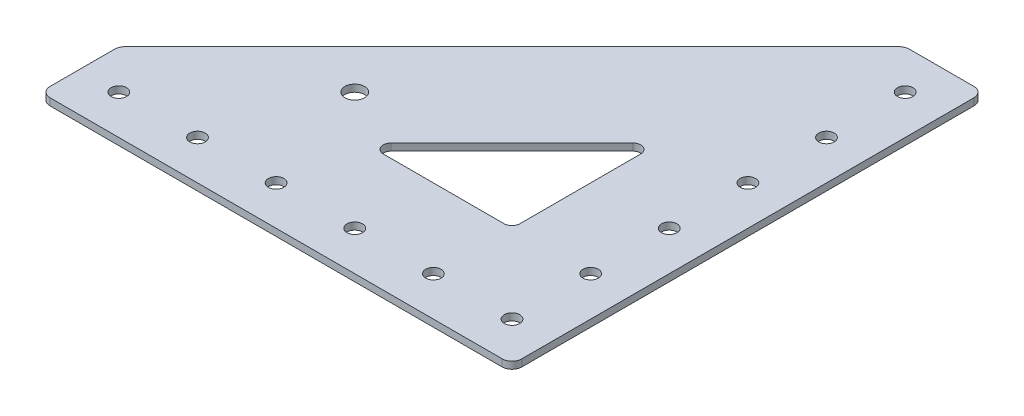
ISO-10303-21;
HEADER;
FILE_DESCRIPTION(('STEP AP214'),'2;1');
FILE_NAME('part.step','',(''),(''),'','','');
FILE_SCHEMA(('AUTOMOTIVE_DESIGN { 1 0 10303 214 1 1 1 1 }'));
ENDSEC;
DATA;
#1=APPLICATION_CONTEXT('core data for automotive mechanical design processes');
#2=APPLICATION_PROTOCOL_DEFINITION('international standard','automotive_design',2000,#1);
#3=PRODUCT_CONTEXT('',#1,'mechanical');
#4=PRODUCT('Part','Part','',(#3));
#5=PRODUCT_RELATED_PRODUCT_CATEGORY('part','',(#4));
#6=PRODUCT_DEFINITION_FORMATION('','',#4);
#7=PRODUCT_DEFINITION_CONTEXT('part definition',#1,'design');
#8=PRODUCT_DEFINITION('design','',#6,#7);
#9=PRODUCT_DEFINITION_SHAPE('','',#8);
#10=(LENGTH_UNIT() NAMED_UNIT(*) SI_UNIT(.MILLI.,.METRE.));
#11=(NAMED_UNIT(*) PLANE_ANGLE_UNIT() SI_UNIT($,.RADIAN.));
#12=(NAMED_UNIT(*) SI_UNIT($,.STERADIAN.) SOLID_ANGLE_UNIT());
#13=UNCERTAINTY_MEASURE_WITH_UNIT(LENGTH_MEASURE(1.E-05),#10,'distance_accuracy_value','');
#14=(GEOMETRIC_REPRESENTATION_CONTEXT(3) GLOBAL_UNCERTAINTY_ASSIGNED_CONTEXT((#13)) GLOBAL_UNIT_ASSIGNED_CONTEXT((#10,
#11,#12)) REPRESENTATION_CONTEXT('',''));
#15=CARTESIAN_POINT('',(0.,0.,0.));
#16=DIRECTION('',(0.,0.,1.));
#17=DIRECTION('',(1.,0.,0.));
#18=AXIS2_PLACEMENT_3D('',#15,#16,#17);
#19=CARTESIAN_POINT('',(0.,1.143,0.));
#20=DIRECTION('',(0.,1.,0.));
#21=DIRECTION('',(0.,0.,1.));
#22=AXIS2_PLACEMENT_3D('',#19,#20,#21);
#23=PLANE('',#22);
#24=DIRECTION('',(0.,0.,-1.));
#25=VECTOR('',#24,1.);
#26=CARTESIAN_POINT('',(-38.1,1.143,-38.1));
#27=LINE('',#26,#25);
#28=CARTESIAN_POINT('',(-38.1,1.143,-40.64));
#29=VERTEX_POINT('',#28);
#30=CARTESIAN_POINT('',(-38.1,1.143,-79.6863608251574));
#31=VERTEX_POINT('',#30);
#32=EDGE_CURVE('E265',#29,#31,#27,.T.);
#33=ORIENTED_EDGE('',*,*,#32,.F.);
#34=CARTESIAN_POINT('',(-40.64,1.143,-40.64));
#35=DIRECTION('',(0.,1.,0.));
#36=DIRECTION('',(0.,0.,1.));
#37=AXIS2_PLACEMENT_3D('',#34,#35,#36);
#38=CIRCLE('',#37,2.54);
#39=CARTESIAN_POINT('',(-40.64,1.143,-38.1));
#40=VERTEX_POINT('',#39);
#41=EDGE_CURVE('E253',#29,#40,#38,.F.);
#42=ORIENTED_EDGE('',*,*,#41,.T.);
#43=DIRECTION('',(1.,0.,0.));
#44=VECTOR('',#43,1.);
#45=CARTESIAN_POINT('',(-85.8184632735851,1.143,-38.1));
#46=LINE('',#45,#44);
#47=CARTESIAN_POINT('',(-79.6863608251574,1.143,-38.1));
#48=VERTEX_POINT('',#47);
#49=EDGE_CURVE('E286',#48,#40,#46,.T.);
#50=ORIENTED_EDGE('',*,*,#49,.F.);
#51=CARTESIAN_POINT('',(-79.6863608251574,1.143,-40.64));
#52=DIRECTION('',(0.,1.,0.));
#53=DIRECTION('',(0.,0.,1.));
#54=AXIS2_PLACEMENT_3D('',#51,#52,#53);
#55=CIRCLE('',#54,2.54);
#56=CARTESIAN_POINT('',(-81.4824120493713,1.143,-42.4360512242138));
#57=VERTEX_POINT('',#56);
#58=EDGE_CURVE('E257',#48,#57,#55,.F.);
#59=ORIENTED_EDGE('',*,*,#58,.T.);
#60=DIRECTION('',(-0.707106781186547,0.,0.707106781186547));
#61=VECTOR('',#60,1.);
#62=CARTESIAN_POINT('',(-38.1,1.143,-85.8184632735851));
#63=LINE('',#62,#61);
#64=CARTESIAN_POINT('',(-42.4360512242138,1.143,-81.4824120493712));
#65=VERTEX_POINT('',#64);
#66=EDGE_CURVE('E266',#65,#57,#63,.T.);
#67=ORIENTED_EDGE('',*,*,#66,.F.);
#68=CARTESIAN_POINT('',(-40.64,1.143,-79.6863608251574));
#69=DIRECTION('',(0.,1.,0.));
#70=DIRECTION('',(0.,0.,1.));
#71=AXIS2_PLACEMENT_3D('',#68,#69,#70);
#72=CIRCLE('',#71,2.54);
#73=EDGE_CURVE('E46',#65,#31,#72,.F.);
#74=ORIENTED_EDGE('',*,*,#73,.T.);
#75=EDGE_LOOP('',(#33,#42,#50,#59,#67,#74));
#76=FACE_BOUND('',#75,.T.);
#77=CARTESIAN_POINT('',(-139.7,1.143,-12.6999999999921));
#78=DIRECTION('',(0.,1.,0.));
#79=DIRECTION('',(0.,0.,1.));
#80=AXIS2_PLACEMENT_3D('',#77,#78,#79);
#81=CIRCLE('',#80,2.48920000000049);
#82=CARTESIAN_POINT('',(-139.7,1.143,-10.2107999999916));
#83=VERTEX_POINT('',#82);
#84=EDGE_CURVE('E298',#83,#83,#81,.T.);
#85=ORIENTED_EDGE('',*,*,#84,.F.);
#86=EDGE_LOOP('',(#85));
#87=FACE_BOUND('',#86,.T.);
#88=CARTESIAN_POINT('',(-12.7000000000003,1.143,-88.9));
#89=DIRECTION('',(0.,1.,0.));
#90=DIRECTION('',(0.,0.,1.));
#91=AXIS2_PLACEMENT_3D('',#88,#89,#90);
#92=CIRCLE('',#91,2.48919999999999);
#93=CARTESIAN_POINT('',(-12.7000000000003,1.143,-86.4108));
#94=VERTEX_POINT('',#93);
#95=EDGE_CURVE('E310',#94,#94,#92,.T.);
#96=ORIENTED_EDGE('',*,*,#95,.F.);
#97=EDGE_LOOP('',(#96));
#98=FACE_BOUND('',#97,.T.);
#99=CARTESIAN_POINT('',(-12.7000000000001,1.143,-38.1));
#100=DIRECTION('',(0.,1.,0.));
#101=DIRECTION('',(0.,0.,1.));
#102=AXIS2_PLACEMENT_3D('',#99,#100,#101);
#103=CIRCLE('',#102,2.48920000000001);
#104=CARTESIAN_POINT('',(-12.7000000000001,1.143,-35.6108));
#105=VERTEX_POINT('',#104);
#106=EDGE_CURVE('E322',#105,#105,#103,.T.);
#107=ORIENTED_EDGE('',*,*,#106,.F.);
#108=EDGE_LOOP('',(#107));
#109=FACE_BOUND('',#108,.T.);
#110=CARTESIAN_POINT('',(-114.3,1.143,-12.6999999999951));
#111=DIRECTION('',(0.,1.,0.));
#112=DIRECTION('',(0.,0.,1.));
#113=AXIS2_PLACEMENT_3D('',#110,#111,#112);
#114=CIRCLE('',#113,2.4892);
#115=CARTESIAN_POINT('',(-114.3,1.143,-10.2107999999951));
#116=VERTEX_POINT('',#115);
#117=EDGE_CURVE('E334',#116,#116,#114,.T.);
#118=ORIENTED_EDGE('',*,*,#117,.F.);
#119=EDGE_LOOP('',(#118));
#120=FACE_BOUND('',#119,.T.);
#121=CARTESIAN_POINT('',(-63.5,1.143,-12.6999999999975));
#122=DIRECTION('',(0.,1.,0.));
#123=DIRECTION('',(0.,0.,1.));
#124=AXIS2_PLACEMENT_3D('',#121,#122,#123);
#125=CIRCLE('',#124,2.4892);
#126=CARTESIAN_POINT('',(-63.5,1.143,-10.2107999999975));
#127=VERTEX_POINT('',#126);
#128=EDGE_CURVE('E346',#127,#127,#125,.T.);
#129=ORIENTED_EDGE('',*,*,#128,.F.);
#130=EDGE_LOOP('',(#129));
#131=FACE_BOUND('',#130,.T.);
#132=CARTESIAN_POINT('',(-12.7,1.143,-12.7));
#133=DIRECTION('',(0.,1.,0.));
#134=DIRECTION('',(0.,0.,1.));
#135=AXIS2_PLACEMENT_3D('',#132,#133,#134);
#136=CIRCLE('',#135,2.4892);
#137=CARTESIAN_POINT('',(-12.7,1.143,-10.2108));
#138=VERTEX_POINT('',#137);
#139=EDGE_CURVE('E185',#138,#138,#136,.T.);
#140=ORIENTED_EDGE('',*,*,#139,.F.);
#141=EDGE_LOOP('',(#140));
#142=FACE_BOUND('',#141,.T.);
#143=DIRECTION('',(-0.707106781186548,0.,0.707106781186548));
#144=VECTOR('',#143,1.);
#145=CARTESIAN_POINT('',(-25.4,1.143,-152.4));
#146=LINE('',#145,#144);
#147=CARTESIAN_POINT('',(-26.3299359697327,1.143,-151.470064030267));
#148=VERTEX_POINT('',#147);
#149=CARTESIAN_POINT('',(-151.470064030267,1.143,-26.3299359697327));
#150=VERTEX_POINT('',#149);
#151=EDGE_CURVE('E368',#148,#150,#146,.T.);
#152=ORIENTED_EDGE('',*,*,#151,.T.);
#153=CARTESIAN_POINT('',(-149.225,1.143,-24.0848719394655));
#154=DIRECTION('',(0.,1.,0.));
#155=DIRECTION('',(0.,0.,1.));
#156=AXIS2_PLACEMENT_3D('',#153,#154,#155);
#157=CIRCLE('',#156,3.175);
#158=CARTESIAN_POINT('',(-152.4,1.143,-24.0848719394655));
#159=VERTEX_POINT('',#158);
#160=EDGE_CURVE('E223',#150,#159,#157,.T.);
#161=ORIENTED_EDGE('',*,*,#160,.T.);
#162=DIRECTION('',(0.,0.,1.));
#163=VECTOR('',#162,1.);
#164=CARTESIAN_POINT('',(-152.4,1.143,-25.4));
#165=LINE('',#164,#163);
#166=CARTESIAN_POINT('',(-152.4,1.143,-3.175));
#167=VERTEX_POINT('',#166);
#168=EDGE_CURVE('E172',#159,#167,#165,.T.);
#169=ORIENTED_EDGE('',*,*,#168,.T.);
#170=CARTESIAN_POINT('',(-149.225,1.143,-3.175));
#171=DIRECTION('',(0.,1.,0.));
#172=DIRECTION('',(0.,0.,1.));
#173=AXIS2_PLACEMENT_3D('',#170,#171,#172);
#174=CIRCLE('',#173,3.175);
#175=CARTESIAN_POINT('',(-149.225,1.143,0.));
#176=VERTEX_POINT('',#175);
#177=EDGE_CURVE('E199',#167,#176,#174,.T.);
#178=ORIENTED_EDGE('',*,*,#177,.T.);
#179=DIRECTION('',(1.,0.,0.));
#180=VECTOR('',#179,1.);
#181=CARTESIAN_POINT('',(-152.4,1.143,0.));
#182=LINE('',#181,#180);
#183=CARTESIAN_POINT('',(-3.17500000000007,1.143,0.));
#184=VERTEX_POINT('',#183);
#185=EDGE_CURVE('E192',#176,#184,#182,.T.);
#186=ORIENTED_EDGE('',*,*,#185,.T.);
#187=CARTESIAN_POINT('',(-3.175,1.143,-3.175));
#188=DIRECTION('',(0.,1.,0.));
#189=DIRECTION('',(0.,0.,1.));
#190=AXIS2_PLACEMENT_3D('',#187,#188,#189);
#191=CIRCLE('',#190,3.175);
#192=CARTESIAN_POINT('',(0.,1.143,-3.175));
#193=VERTEX_POINT('',#192);
#194=EDGE_CURVE('E201',#184,#193,#191,.T.);
#195=ORIENTED_EDGE('',*,*,#194,.T.);
#196=DIRECTION('',(0.,0.,-1.));
#197=VECTOR('',#196,1.);
#198=CARTESIAN_POINT('',(0.,1.143,0.));
#199=LINE('',#198,#197);
#200=CARTESIAN_POINT('',(0.,1.143,-149.225));
#201=VERTEX_POINT('',#200);
#202=EDGE_CURVE('E171',#193,#201,#199,.T.);
#203=ORIENTED_EDGE('',*,*,#202,.T.);
#204=CARTESIAN_POINT('',(-3.175,1.143,-149.225));
#205=DIRECTION('',(0.,1.,0.));
#206=DIRECTION('',(0.,0.,1.));
#207=AXIS2_PLACEMENT_3D('',#204,#205,#206);
#208=CIRCLE('',#207,3.175);
#209=CARTESIAN_POINT('',(-3.175,1.143,-152.4));
#210=VERTEX_POINT('',#209);
#211=EDGE_CURVE('E219',#201,#210,#208,.T.);
#212=ORIENTED_EDGE('',*,*,#211,.T.);
#213=DIRECTION('',(-1.,0.,0.));
#214=VECTOR('',#213,1.);
#215=CARTESIAN_POINT('',(0.,1.143,-152.4));
#216=LINE('',#215,#214);
#217=CARTESIAN_POINT('',(-24.0848719394654,1.143,-152.4));
#218=VERTEX_POINT('',#217);
#219=EDGE_CURVE('E365',#210,#218,#216,.T.);
#220=ORIENTED_EDGE('',*,*,#219,.T.);
#221=CARTESIAN_POINT('',(-24.0848719394654,1.143,-149.225));
#222=DIRECTION('',(0.,1.,0.));
#223=DIRECTION('',(0.,0.,1.));
#224=AXIS2_PLACEMENT_3D('',#221,#222,#223);
#225=CIRCLE('',#224,3.175);
#226=EDGE_CURVE('E221',#218,#148,#225,.T.);
#227=ORIENTED_EDGE('',*,*,#226,.T.);
#228=EDGE_LOOP('',(#152,#161,#169,#178,#186,#195,#203,#212,#220,#227));
#229=FACE_BOUND('',#228,.T.);
#230=CARTESIAN_POINT('',(-38.1,1.143,-12.6999999999988));
#231=DIRECTION('',(0.,1.,0.));
#232=DIRECTION('',(0.,0.,1.));
#233=AXIS2_PLACEMENT_3D('',#230,#231,#232);
#234=CIRCLE('',#233,2.4892);
#235=CARTESIAN_POINT('',(-38.1,1.143,-10.2107999999988));
#236=VERTEX_POINT('',#235);
#237=EDGE_CURVE('E352',#236,#236,#234,.T.);
#238=ORIENTED_EDGE('',*,*,#237,.F.);
#239=EDGE_LOOP('',(#238));
#240=FACE_BOUND('',#239,.T.);
#241=CARTESIAN_POINT('',(-88.9,1.143,-12.6999999999963));
#242=DIRECTION('',(0.,1.,0.));
#243=DIRECTION('',(0.,0.,1.));
#244=AXIS2_PLACEMENT_3D('',#241,#242,#243);
#245=CIRCLE('',#244,2.48920000000002);
#246=CARTESIAN_POINT('',(-88.9,1.143,-10.2107999999963));
#247=VERTEX_POINT('',#246);
#248=EDGE_CURVE('E340',#247,#247,#245,.T.);
#249=ORIENTED_EDGE('',*,*,#248,.F.);
#250=EDGE_LOOP('',(#249));
#251=FACE_BOUND('',#250,.T.);
#252=CARTESIAN_POINT('',(-101.6,1.143,-50.8));
#253=DIRECTION('',(0.,1.,0.));
#254=DIRECTION('',(0.,0.,1.));
#255=AXIS2_PLACEMENT_3D('',#252,#253,#254);
#256=CIRCLE('',#255,3.175);
#257=CARTESIAN_POINT('',(-101.6,1.143,-47.625));
#258=VERTEX_POINT('',#257);
#259=EDGE_CURVE('E328',#258,#258,#256,.T.);
#260=ORIENTED_EDGE('',*,*,#259,.F.);
#261=EDGE_LOOP('',(#260));
#262=FACE_BOUND('',#261,.T.);
#263=CARTESIAN_POINT('',(-12.7000000000002,1.143,-63.5));
#264=DIRECTION('',(0.,1.,0.));
#265=DIRECTION('',(0.,0.,1.));
#266=AXIS2_PLACEMENT_3D('',#263,#264,#265);
#267=CIRCLE('',#266,2.4892);
#268=CARTESIAN_POINT('',(-12.7000000000002,1.143,-61.0108));
#269=VERTEX_POINT('',#268);
#270=EDGE_CURVE('E316',#269,#269,#267,.T.);
#271=ORIENTED_EDGE('',*,*,#270,.F.);
#272=EDGE_LOOP('',(#271));
#273=FACE_BOUND('',#272,.T.);
#274=CARTESIAN_POINT('',(-12.7000000000003,1.143,-114.3));
#275=DIRECTION('',(0.,1.,0.));
#276=DIRECTION('',(0.,0.,1.));
#277=AXIS2_PLACEMENT_3D('',#274,#275,#276);
#278=CIRCLE('',#277,2.48919999999999);
#279=CARTESIAN_POINT('',(-12.7000000000003,1.143,-111.8108));
#280=VERTEX_POINT('',#279);
#281=EDGE_CURVE('E304',#280,#280,#278,.T.);
#282=ORIENTED_EDGE('',*,*,#281,.F.);
#283=EDGE_LOOP('',(#282));
#284=FACE_BOUND('',#283,.T.);
#285=CARTESIAN_POINT('',(-12.7000000000004,1.143,-139.7));
#286=DIRECTION('',(0.,1.,0.));
#287=DIRECTION('',(0.,0.,1.));
#288=AXIS2_PLACEMENT_3D('',#285,#286,#287);
#289=CIRCLE('',#288,2.4892);
#290=CARTESIAN_POINT('',(-12.7000000000004,1.143,-137.2108));
#291=VERTEX_POINT('',#290);
#292=EDGE_CURVE('E291',#291,#291,#289,.T.);
#293=ORIENTED_EDGE('',*,*,#292,.F.);
#294=EDGE_LOOP('',(#293));
#295=FACE_BOUND('',#294,.T.);
#296=ADVANCED_FACE('F38',(#76,#87,#98,#109,#120,#131,#142,#229,#240,#251,#262,#273,#284,#295),
#23,.T.);
#297=CARTESIAN_POINT('',(0.,-1.143,0.));
#298=DIRECTION('',(0.,1.,0.));
#299=DIRECTION('',(0.,0.,1.));
#300=AXIS2_PLACEMENT_3D('',#297,#298,#299);
#301=PLANE('',#300);
#302=DIRECTION('',(-0.707106781186548,0.,0.707106781186548));
#303=VECTOR('',#302,1.);
#304=CARTESIAN_POINT('',(-61.9592316367925,-1.143,-61.9592316367925));
#305=LINE('',#304,#303);
#306=CARTESIAN_POINT('',(-42.4360512242138,-1.143,-81.4824120493712));
#307=VERTEX_POINT('',#306);
#308=CARTESIAN_POINT('',(-81.4824120493713,-1.143,-42.4360512242138));
#309=VERTEX_POINT('',#308);
#310=EDGE_CURVE('E232',#307,#309,#305,.T.);
#311=ORIENTED_EDGE('',*,*,#310,.T.);
#312=CARTESIAN_POINT('',(-79.6863608251574,-1.143,-40.64));
#313=DIRECTION('',(0.,1.,0.));
#314=DIRECTION('',(0.,0.,1.));
#315=AXIS2_PLACEMENT_3D('',#312,#313,#314);
#316=CIRCLE('',#315,2.54);
#317=CARTESIAN_POINT('',(-79.6863608251574,-1.143,-38.1));
#318=VERTEX_POINT('',#317);
#319=EDGE_CURVE('E259',#309,#318,#316,.T.);
#320=ORIENTED_EDGE('',*,*,#319,.T.);
#321=DIRECTION('',(1.,0.,0.));
#322=VECTOR('',#321,1.);
#323=CARTESIAN_POINT('',(0.,-1.143,-38.1));
#324=LINE('',#323,#322);
#325=CARTESIAN_POINT('',(-40.64,-1.143,-38.1));
#326=VERTEX_POINT('',#325);
#327=EDGE_CURVE('E234',#318,#326,#324,.T.);
#328=ORIENTED_EDGE('',*,*,#327,.T.);
#329=CARTESIAN_POINT('',(-40.64,-1.143,-40.64));
#330=DIRECTION('',(0.,1.,0.));
#331=DIRECTION('',(0.,0.,1.));
#332=AXIS2_PLACEMENT_3D('',#329,#330,#331);
#333=CIRCLE('',#332,2.54);
#334=CARTESIAN_POINT('',(-38.1,-1.143,-40.64));
#335=VERTEX_POINT('',#334);
#336=EDGE_CURVE('E255',#326,#335,#333,.T.);
#337=ORIENTED_EDGE('',*,*,#336,.T.);
#338=DIRECTION('',(0.,0.,-1.));
#339=VECTOR('',#338,1.);
#340=CARTESIAN_POINT('',(-38.1,-1.143,0.));
#341=LINE('',#340,#339);
#342=CARTESIAN_POINT('',(-38.1,-1.143,-79.6863608251574));
#343=VERTEX_POINT('',#342);
#344=EDGE_CURVE('E237',#335,#343,#341,.T.);
#345=ORIENTED_EDGE('',*,*,#344,.T.);
#346=CARTESIAN_POINT('',(-40.64,-1.143,-79.6863608251574));
#347=DIRECTION('',(0.,1.,0.));
#348=DIRECTION('',(0.,0.,1.));
#349=AXIS2_PLACEMENT_3D('',#346,#347,#348);
#350=CIRCLE('',#349,2.54);
#351=EDGE_CURVE('E12',#343,#307,#350,.T.);
#352=ORIENTED_EDGE('',*,*,#351,.T.);
#353=EDGE_LOOP('',(#311,#320,#328,#337,#345,#352));
#354=FACE_BOUND('',#353,.T.);
#355=CARTESIAN_POINT('',(-139.7,-1.143,-12.6999999999921));
#356=DIRECTION('',(0.,1.,0.));
#357=DIRECTION('',(0.,0.,1.));
#358=AXIS2_PLACEMENT_3D('',#355,#356,#357);
#359=CIRCLE('',#358,2.48920000000049);
#360=CARTESIAN_POINT('',(-139.7,-1.143,-10.2107999999916));
#361=VERTEX_POINT('',#360);
#362=EDGE_CURVE('E296',#361,#361,#359,.T.);
#363=ORIENTED_EDGE('',*,*,#362,.T.);
#364=EDGE_LOOP('',(#363));
#365=FACE_BOUND('',#364,.T.);
#366=CARTESIAN_POINT('',(-12.7000000000003,-1.143,-88.9));
#367=DIRECTION('',(0.,1.,0.));
#368=DIRECTION('',(0.,0.,1.));
#369=AXIS2_PLACEMENT_3D('',#366,#367,#368);
#370=CIRCLE('',#369,2.48919999999999);
#371=CARTESIAN_POINT('',(-12.7000000000003,-1.143,-86.4108));
#372=VERTEX_POINT('',#371);
#373=EDGE_CURVE('E307',#372,#372,#370,.T.);
#374=ORIENTED_EDGE('',*,*,#373,.T.);
#375=EDGE_LOOP('',(#374));
#376=FACE_BOUND('',#375,.T.);
#377=CARTESIAN_POINT('',(-12.7000000000001,-1.143,-38.1));
#378=DIRECTION('',(0.,1.,0.));
#379=DIRECTION('',(0.,0.,1.));
#380=AXIS2_PLACEMENT_3D('',#377,#378,#379);
#381=CIRCLE('',#380,2.48920000000001);
#382=CARTESIAN_POINT('',(-12.7000000000001,-1.143,-35.6108));
#383=VERTEX_POINT('',#382);
#384=EDGE_CURVE('E319',#383,#383,#381,.T.);
#385=ORIENTED_EDGE('',*,*,#384,.T.);
#386=EDGE_LOOP('',(#385));
#387=FACE_BOUND('',#386,.T.);
#388=CARTESIAN_POINT('',(-114.3,-1.143,-12.6999999999951));
#389=DIRECTION('',(0.,1.,0.));
#390=DIRECTION('',(0.,0.,1.));
#391=AXIS2_PLACEMENT_3D('',#388,#389,#390);
#392=CIRCLE('',#391,2.4892);
#393=CARTESIAN_POINT('',(-114.3,-1.143,-10.2107999999951));
#394=VERTEX_POINT('',#393);
#395=EDGE_CURVE('E331',#394,#394,#392,.T.);
#396=ORIENTED_EDGE('',*,*,#395,.T.);
#397=EDGE_LOOP('',(#396));
#398=FACE_BOUND('',#397,.T.);
#399=CARTESIAN_POINT('',(-63.5,-1.143,-12.6999999999975));
#400=DIRECTION('',(0.,1.,0.));
#401=DIRECTION('',(0.,0.,1.));
#402=AXIS2_PLACEMENT_3D('',#399,#400,#401);
#403=CIRCLE('',#402,2.4892);
#404=CARTESIAN_POINT('',(-63.5,-1.143,-10.2107999999975));
#405=VERTEX_POINT('',#404);
#406=EDGE_CURVE('E343',#405,#405,#403,.T.);
#407=ORIENTED_EDGE('',*,*,#406,.T.);
#408=EDGE_LOOP('',(#407));
#409=FACE_BOUND('',#408,.T.);
#410=CARTESIAN_POINT('',(-12.7,-1.143,-12.7));
#411=DIRECTION('',(0.,1.,0.));
#412=DIRECTION('',(0.,0.,1.));
#413=AXIS2_PLACEMENT_3D('',#410,#411,#412);
#414=CIRCLE('',#413,2.4892);
#415=CARTESIAN_POINT('',(-12.7,-1.143,-10.2108));
#416=VERTEX_POINT('',#415);
#417=EDGE_CURVE('E355',#416,#416,#414,.T.);
#418=ORIENTED_EDGE('',*,*,#417,.T.);
#419=EDGE_LOOP('',(#418));
#420=FACE_BOUND('',#419,.T.);
#421=DIRECTION('',(0.,0.,1.));
#422=VECTOR('',#421,1.);
#423=CARTESIAN_POINT('',(-152.4,-1.143,-25.4));
#424=LINE('',#423,#422);
#425=CARTESIAN_POINT('',(-152.4,-1.143,-24.0848719394655));
#426=VERTEX_POINT('',#425);
#427=CARTESIAN_POINT('',(-152.4,-1.143,-3.175));
#428=VERTEX_POINT('',#427);
#429=EDGE_CURVE('E191',#426,#428,#424,.T.);
#430=ORIENTED_EDGE('',*,*,#429,.F.);
#431=CARTESIAN_POINT('',(-149.225,-1.143,-24.0848719394655));
#432=DIRECTION('',(0.,1.,0.));
#433=DIRECTION('',(0.,0.,1.));
#434=AXIS2_PLACEMENT_3D('',#431,#432,#433);
#435=CIRCLE('',#434,3.175);
#436=CARTESIAN_POINT('',(-151.470064030267,-1.143,-26.3299359697327));
#437=VERTEX_POINT('',#436);
#438=EDGE_CURVE('E212',#426,#437,#435,.F.);
#439=ORIENTED_EDGE('',*,*,#438,.T.);
#440=DIRECTION('',(-0.707106781186548,0.,0.707106781186548));
#441=VECTOR('',#440,1.);
#442=CARTESIAN_POINT('',(-25.4,-1.143,-152.4));
#443=LINE('',#442,#441);
#444=CARTESIAN_POINT('',(-26.3299359697327,-1.143,-151.470064030267));
#445=VERTEX_POINT('',#444);
#446=EDGE_CURVE('E183',#445,#437,#443,.T.);
#447=ORIENTED_EDGE('',*,*,#446,.F.);
#448=CARTESIAN_POINT('',(-24.0848719394654,-1.143,-149.225));
#449=DIRECTION('',(0.,1.,0.));
#450=DIRECTION('',(0.,0.,1.));
#451=AXIS2_PLACEMENT_3D('',#448,#449,#450);
#452=CIRCLE('',#451,3.175);
#453=CARTESIAN_POINT('',(-24.0848719394654,-1.143,-152.4));
#454=VERTEX_POINT('',#453);
#455=EDGE_CURVE('E210',#445,#454,#452,.F.);
#456=ORIENTED_EDGE('',*,*,#455,.T.);
#457=DIRECTION('',(-1.,0.,0.));
#458=VECTOR('',#457,1.);
#459=CARTESIAN_POINT('',(0.,-1.143,-152.4));
#460=LINE('',#459,#458);
#461=CARTESIAN_POINT('',(-3.175,-1.143,-152.4));
#462=VERTEX_POINT('',#461);
#463=EDGE_CURVE('E179',#462,#454,#460,.T.);
#464=ORIENTED_EDGE('',*,*,#463,.F.);
#465=CARTESIAN_POINT('',(-3.175,-1.143,-149.225));
#466=DIRECTION('',(0.,1.,0.));
#467=DIRECTION('',(0.,0.,1.));
#468=AXIS2_PLACEMENT_3D('',#465,#466,#467);
#469=CIRCLE('',#468,3.175);
#470=CARTESIAN_POINT('',(0.,-1.143,-149.225));
#471=VERTEX_POINT('',#470);
#472=EDGE_CURVE('E178',#462,#471,#469,.F.);
#473=ORIENTED_EDGE('',*,*,#472,.T.);
#474=DIRECTION('',(0.,0.,-1.));
#475=VECTOR('',#474,1.);
#476=CARTESIAN_POINT('',(0.,-1.143,0.));
#477=LINE('',#476,#475);
#478=CARTESIAN_POINT('',(0.,-1.143,-3.175));
#479=VERTEX_POINT('',#478);
#480=EDGE_CURVE('E168',#479,#471,#477,.T.);
#481=ORIENTED_EDGE('',*,*,#480,.F.);
#482=CARTESIAN_POINT('',(-3.175,-1.143,-3.175));
#483=DIRECTION('',(0.,1.,0.));
#484=DIRECTION('',(0.,0.,1.));
#485=AXIS2_PLACEMENT_3D('',#482,#483,#484);
#486=CIRCLE('',#485,3.175);
#487=CARTESIAN_POINT('',(-3.17500000000007,-1.143,0.));
#488=VERTEX_POINT('',#487);
#489=EDGE_CURVE('E151',#479,#488,#486,.F.);
#490=ORIENTED_EDGE('',*,*,#489,.T.);
#491=DIRECTION('',(1.,0.,0.));
#492=VECTOR('',#491,1.);
#493=CARTESIAN_POINT('',(-152.4,-1.143,0.));
#494=LINE('',#493,#492);
#495=CARTESIAN_POINT('',(-149.225,-1.143,0.));
#496=VERTEX_POINT('',#495);
#497=EDGE_CURVE('E180',#496,#488,#494,.T.);
#498=ORIENTED_EDGE('',*,*,#497,.F.);
#499=CARTESIAN_POINT('',(-149.225,-1.143,-3.175));
#500=DIRECTION('',(0.,1.,0.));
#501=DIRECTION('',(0.,0.,1.));
#502=AXIS2_PLACEMENT_3D('',#499,#500,#501);
#503=CIRCLE('',#502,3.175);
#504=EDGE_CURVE('E162',#496,#428,#503,.F.);
#505=ORIENTED_EDGE('',*,*,#504,.T.);
#506=EDGE_LOOP('',(#430,#439,#447,#456,#464,#473,#481,#490,#498,#505));
#507=FACE_BOUND('',#506,.T.);
#508=CARTESIAN_POINT('',(-38.1,-1.143,-12.6999999999988));
#509=DIRECTION('',(0.,1.,0.));
#510=DIRECTION('',(0.,0.,1.));
#511=AXIS2_PLACEMENT_3D('',#508,#509,#510);
#512=CIRCLE('',#511,2.4892);
#513=CARTESIAN_POINT('',(-38.1,-1.143,-10.2107999999988));
#514=VERTEX_POINT('',#513);
#515=EDGE_CURVE('E349',#514,#514,#512,.T.);
#516=ORIENTED_EDGE('',*,*,#515,.T.);
#517=EDGE_LOOP('',(#516));
#518=FACE_BOUND('',#517,.T.);
#519=CARTESIAN_POINT('',(-88.9,-1.143,-12.6999999999963));
#520=DIRECTION('',(0.,1.,0.));
#521=DIRECTION('',(0.,0.,1.));
#522=AXIS2_PLACEMENT_3D('',#519,#520,#521);
#523=CIRCLE('',#522,2.48920000000002);
#524=CARTESIAN_POINT('',(-88.9,-1.143,-10.2107999999963));
#525=VERTEX_POINT('',#524);
#526=EDGE_CURVE('E337',#525,#525,#523,.T.);
#527=ORIENTED_EDGE('',*,*,#526,.T.);
#528=EDGE_LOOP('',(#527));
#529=FACE_BOUND('',#528,.T.);
#530=CARTESIAN_POINT('',(-101.6,-1.143,-50.8));
#531=DIRECTION('',(0.,1.,0.));
#532=DIRECTION('',(0.,0.,1.));
#533=AXIS2_PLACEMENT_3D('',#530,#531,#532);
#534=CIRCLE('',#533,3.175);
#535=CARTESIAN_POINT('',(-101.6,-1.143,-47.625));
#536=VERTEX_POINT('',#535);
#537=EDGE_CURVE('E325',#536,#536,#534,.T.);
#538=ORIENTED_EDGE('',*,*,#537,.T.);
#539=EDGE_LOOP('',(#538));
#540=FACE_BOUND('',#539,.T.);
#541=CARTESIAN_POINT('',(-12.7000000000002,-1.143,-63.5));
#542=DIRECTION('',(0.,1.,0.));
#543=DIRECTION('',(0.,0.,1.));
#544=AXIS2_PLACEMENT_3D('',#541,#542,#543);
#545=CIRCLE('',#544,2.4892);
#546=CARTESIAN_POINT('',(-12.7000000000002,-1.143,-61.0108));
#547=VERTEX_POINT('',#546);
#548=EDGE_CURVE('E313',#547,#547,#545,.T.);
#549=ORIENTED_EDGE('',*,*,#548,.T.);
#550=EDGE_LOOP('',(#549));
#551=FACE_BOUND('',#550,.T.);
#552=CARTESIAN_POINT('',(-12.7000000000003,-1.143,-114.3));
#553=DIRECTION('',(0.,1.,0.));
#554=DIRECTION('',(0.,0.,1.));
#555=AXIS2_PLACEMENT_3D('',#552,#553,#554);
#556=CIRCLE('',#555,2.48919999999999);
#557=CARTESIAN_POINT('',(-12.7000000000003,-1.143,-111.8108));
#558=VERTEX_POINT('',#557);
#559=EDGE_CURVE('E301',#558,#558,#556,.T.);
#560=ORIENTED_EDGE('',*,*,#559,.T.);
#561=EDGE_LOOP('',(#560));
#562=FACE_BOUND('',#561,.T.);
#563=CARTESIAN_POINT('',(-12.7000000000004,-1.143,-139.7));
#564=DIRECTION('',(0.,1.,0.));
#565=DIRECTION('',(0.,0.,1.));
#566=AXIS2_PLACEMENT_3D('',#563,#564,#565);
#567=CIRCLE('',#566,2.4892);
#568=CARTESIAN_POINT('',(-12.7000000000004,-1.143,-137.2108));
#569=VERTEX_POINT('',#568);
#570=EDGE_CURVE('E288',#569,#569,#567,.T.);
#571=ORIENTED_EDGE('',*,*,#570,.T.);
#572=EDGE_LOOP('',(#571));
#573=FACE_BOUND('',#572,.T.);
#574=ADVANCED_FACE('F175',(#354,#365,#376,#387,#398,#409,#420,#507,#518,#529,#540,#551,#562,
#573),#301,.F.);
#575=CARTESIAN_POINT('',(-152.4,1.143,0.));
#576=DIRECTION('',(0.,0.,-1.));
#577=DIRECTION('',(-1.,0.,0.));
#578=AXIS2_PLACEMENT_3D('',#575,#576,#577);
#579=PLANE('',#578);
#580=ORIENTED_EDGE('',*,*,#497,.T.);
#581=DIRECTION('',(0.,-1.,0.));
#582=VECTOR('',#581,1.);
#583=CARTESIAN_POINT('',(-3.17500000000001,1.143,0.));
#584=LINE('',#583,#582);
#585=EDGE_CURVE('E156',#488,#184,#584,.F.);
#586=ORIENTED_EDGE('',*,*,#585,.T.);
#587=ORIENTED_EDGE('',*,*,#185,.F.);
#588=DIRECTION('',(0.,-1.,0.));
#589=VECTOR('',#588,1.);
#590=CARTESIAN_POINT('',(-149.225,1.143,0.));
#591=LINE('',#590,#589);
#592=EDGE_CURVE('E161',#176,#496,#591,.T.);
#593=ORIENTED_EDGE('',*,*,#592,.T.);
#594=EDGE_LOOP('',(#580,#586,#587,#593));
#595=FACE_BOUND('',#594,.T.);
#596=ADVANCED_FACE('F384',(#595),#579,.F.);
#597=CARTESIAN_POINT('',(0.,1.143,0.));
#598=DIRECTION('',(-1.,0.,0.));
#599=DIRECTION('',(0.,0.,1.));
#600=AXIS2_PLACEMENT_3D('',#597,#598,#599);
#601=PLANE('',#600);
#602=ORIENTED_EDGE('',*,*,#480,.T.);
#603=DIRECTION('',(0.,-1.,0.));
#604=VECTOR('',#603,1.);
#605=CARTESIAN_POINT('',(0.,1.143,-149.225));
#606=LINE('',#605,#604);
#607=EDGE_CURVE('E230',#471,#201,#606,.F.);
#608=ORIENTED_EDGE('',*,*,#607,.T.);
#609=ORIENTED_EDGE('',*,*,#202,.F.);
#610=DIRECTION('',(0.,-1.,0.));
#611=VECTOR('',#610,1.);
#612=CARTESIAN_POINT('',(0.,1.143,-3.175));
#613=LINE('',#612,#611);
#614=EDGE_CURVE('E155',#193,#479,#613,.T.);
#615=ORIENTED_EDGE('',*,*,#614,.T.);
#616=EDGE_LOOP('',(#602,#608,#609,#615));
#617=FACE_BOUND('',#616,.T.);
#618=ADVANCED_FACE('F167',(#617),#601,.F.);
#619=CARTESIAN_POINT('',(0.,1.143,-152.4));
#620=DIRECTION('',(0.,0.,1.));
#621=DIRECTION('',(1.,0.,0.));
#622=AXIS2_PLACEMENT_3D('',#619,#620,#621);
#623=PLANE('',#622);
#624=ORIENTED_EDGE('',*,*,#463,.T.);
#625=DIRECTION('',(0.,-1.,0.));
#626=VECTOR('',#625,1.);
#627=CARTESIAN_POINT('',(-24.0848719394654,1.143,-152.4));
#628=LINE('',#627,#626);
#629=EDGE_CURVE('E228',#454,#218,#628,.F.);
#630=ORIENTED_EDGE('',*,*,#629,.T.);
#631=ORIENTED_EDGE('',*,*,#219,.F.);
#632=DIRECTION('',(0.,-1.,0.));
#633=VECTOR('',#632,1.);
#634=CARTESIAN_POINT('',(-3.175,1.143,-152.4));
#635=LINE('',#634,#633);
#636=EDGE_CURVE('E225',#210,#462,#635,.T.);
#637=ORIENTED_EDGE('',*,*,#636,.T.);
#638=EDGE_LOOP('',(#624,#630,#631,#637));
#639=FACE_BOUND('',#638,.T.);
#640=ADVANCED_FACE('F419',(#639),#623,.F.);
#641=CARTESIAN_POINT('',(-25.4,1.143,-152.4));
#642=DIRECTION('',(0.707106781186548,0.,0.707106781186548));
#643=DIRECTION('',(0.707106781186548,0.,-0.707106781186548));
#644=AXIS2_PLACEMENT_3D('',#641,#642,#643);
#645=PLANE('',#644);
#646=ORIENTED_EDGE('',*,*,#446,.T.);
#647=DIRECTION('',(0.,-1.,0.));
#648=VECTOR('',#647,1.);
#649=CARTESIAN_POINT('',(-151.470064030267,1.143,-26.3299359697327));
#650=LINE('',#649,#648);
#651=EDGE_CURVE('E217',#437,#150,#650,.F.);
#652=ORIENTED_EDGE('',*,*,#651,.T.);
#653=ORIENTED_EDGE('',*,*,#151,.F.);
#654=DIRECTION('',(0.,-1.,0.));
#655=VECTOR('',#654,1.);
#656=CARTESIAN_POINT('',(-26.3299359697327,1.143,-151.470064030267));
#657=LINE('',#656,#655);
#658=EDGE_CURVE('E214',#148,#445,#657,.T.);
#659=ORIENTED_EDGE('',*,*,#658,.T.);
#660=EDGE_LOOP('',(#646,#652,#653,#659));
#661=FACE_BOUND('',#660,.T.);
#662=ADVANCED_FACE('F389',(#661),#645,.F.);
#663=CARTESIAN_POINT('',(-152.4,1.143,-25.4));
#664=DIRECTION('',(1.,0.,0.));
#665=DIRECTION('',(0.,0.,-1.));
#666=AXIS2_PLACEMENT_3D('',#663,#664,#665);
#667=PLANE('',#666);
#668=ORIENTED_EDGE('',*,*,#168,.F.);
#669=DIRECTION('',(0.,-1.,0.));
#670=VECTOR('',#669,1.);
#671=CARTESIAN_POINT('',(-152.4,1.143,-24.0848719394655));
#672=LINE('',#671,#670);
#673=EDGE_CURVE('E206',#159,#426,#672,.T.);
#674=ORIENTED_EDGE('',*,*,#673,.T.);
#675=ORIENTED_EDGE('',*,*,#429,.T.);
#676=DIRECTION('',(0.,-1.,0.));
#677=VECTOR('',#676,1.);
#678=CARTESIAN_POINT('',(-152.4,1.143,-3.175));
#679=LINE('',#678,#677);
#680=EDGE_CURVE('E203',#428,#167,#679,.F.);
#681=ORIENTED_EDGE('',*,*,#680,.T.);
#682=EDGE_LOOP('',(#668,#674,#675,#681));
#683=FACE_BOUND('',#682,.T.);
#684=ADVANCED_FACE('F379',(#683),#667,.F.);
#685=CARTESIAN_POINT('',(-12.7,1.143,-12.7));
#686=DIRECTION('',(0.,-1.,0.));
#687=DIRECTION('',(0.,0.,-1.));
#688=AXIS2_PLACEMENT_3D('',#685,#686,#687);
#689=CYLINDRICAL_SURFACE('',#688,2.4892);
#690=ORIENTED_EDGE('',*,*,#139,.T.);
#691=EDGE_LOOP('',(#690));
#692=FACE_BOUND('',#691,.T.);
#693=ORIENTED_EDGE('',*,*,#417,.F.);
#694=EDGE_LOOP('',(#693));
#695=FACE_BOUND('',#694,.T.);
#696=ADVANCED_FACE('F412',(#692,#695),#689,.F.);
#697=CARTESIAN_POINT('',(-38.1,1.143,-12.6999999999988));
#698=DIRECTION('',(0.,-1.,0.));
#699=DIRECTION('',(0.,0.,-1.));
#700=AXIS2_PLACEMENT_3D('',#697,#698,#699);
#701=CYLINDRICAL_SURFACE('',#700,2.4892);
#702=ORIENTED_EDGE('',*,*,#237,.T.);
#703=EDGE_LOOP('',(#702));
#704=FACE_BOUND('',#703,.T.);
#705=ORIENTED_EDGE('',*,*,#515,.F.);
#706=EDGE_LOOP('',(#705));
#707=FACE_BOUND('',#706,.T.);
#708=ADVANCED_FACE('F474',(#704,#707),#701,.F.);
#709=CARTESIAN_POINT('',(-63.5,1.143,-12.6999999999975));
#710=DIRECTION('',(0.,-1.,0.));
#711=DIRECTION('',(0.,0.,-1.));
#712=AXIS2_PLACEMENT_3D('',#709,#710,#711);
#713=CYLINDRICAL_SURFACE('',#712,2.4892);
#714=ORIENTED_EDGE('',*,*,#128,.T.);
#715=EDGE_LOOP('',(#714));
#716=FACE_BOUND('',#715,.T.);
#717=ORIENTED_EDGE('',*,*,#406,.F.);
#718=EDGE_LOOP('',(#717));
#719=FACE_BOUND('',#718,.T.);
#720=ADVANCED_FACE('F471',(#716,#719),#713,.F.);
#721=CARTESIAN_POINT('',(-88.9,1.143,-12.6999999999963));
#722=DIRECTION('',(0.,-1.,0.));
#723=DIRECTION('',(0.,0.,-1.));
#724=AXIS2_PLACEMENT_3D('',#721,#722,#723);
#725=CYLINDRICAL_SURFACE('',#724,2.48920000000002);
#726=ORIENTED_EDGE('',*,*,#248,.T.);
#727=EDGE_LOOP('',(#726));
#728=FACE_BOUND('',#727,.T.);
#729=ORIENTED_EDGE('',*,*,#526,.F.);
#730=EDGE_LOOP('',(#729));
#731=FACE_BOUND('',#730,.T.);
#732=ADVANCED_FACE('F467',(#728,#731),#725,.F.);
#733=CARTESIAN_POINT('',(-114.3,1.143,-12.6999999999951));
#734=DIRECTION('',(0.,-1.,0.));
#735=DIRECTION('',(0.,0.,-1.));
#736=AXIS2_PLACEMENT_3D('',#733,#734,#735);
#737=CYLINDRICAL_SURFACE('',#736,2.4892);
#738=ORIENTED_EDGE('',*,*,#117,.T.);
#739=EDGE_LOOP('',(#738));
#740=FACE_BOUND('',#739,.T.);
#741=ORIENTED_EDGE('',*,*,#395,.F.);
#742=EDGE_LOOP('',(#741));
#743=FACE_BOUND('',#742,.T.);
#744=ADVANCED_FACE('F463',(#740,#743),#737,.F.);
#745=CARTESIAN_POINT('',(-101.6,1.143,-50.8));
#746=DIRECTION('',(0.,-1.,0.));
#747=DIRECTION('',(0.,0.,-1.));
#748=AXIS2_PLACEMENT_3D('',#745,#746,#747);
#749=CYLINDRICAL_SURFACE('',#748,3.175);
#750=ORIENTED_EDGE('',*,*,#259,.T.);
#751=EDGE_LOOP('',(#750));
#752=FACE_BOUND('',#751,.T.);
#753=ORIENTED_EDGE('',*,*,#537,.F.);
#754=EDGE_LOOP('',(#753));
#755=FACE_BOUND('',#754,.T.);
#756=ADVANCED_FACE('F459',(#752,#755),#749,.F.);
#757=CARTESIAN_POINT('',(-12.7000000000001,1.143,-38.1));
#758=DIRECTION('',(0.,-1.,0.));
#759=DIRECTION('',(0.,0.,-1.));
#760=AXIS2_PLACEMENT_3D('',#757,#758,#759);
#761=CYLINDRICAL_SURFACE('',#760,2.48920000000001);
#762=ORIENTED_EDGE('',*,*,#106,.T.);
#763=EDGE_LOOP('',(#762));
#764=FACE_BOUND('',#763,.T.);
#765=ORIENTED_EDGE('',*,*,#384,.F.);
#766=EDGE_LOOP('',(#765));
#767=FACE_BOUND('',#766,.T.);
#768=ADVANCED_FACE('F455',(#764,#767),#761,.F.);
#769=CARTESIAN_POINT('',(-12.7000000000002,1.143,-63.5));
#770=DIRECTION('',(0.,-1.,0.));
#771=DIRECTION('',(0.,0.,-1.));
#772=AXIS2_PLACEMENT_3D('',#769,#770,#771);
#773=CYLINDRICAL_SURFACE('',#772,2.4892);
#774=ORIENTED_EDGE('',*,*,#270,.T.);
#775=EDGE_LOOP('',(#774));
#776=FACE_BOUND('',#775,.T.);
#777=ORIENTED_EDGE('',*,*,#548,.F.);
#778=EDGE_LOOP('',(#777));
#779=FACE_BOUND('',#778,.T.);
#780=ADVANCED_FACE('F451',(#776,#779),#773,.F.);
#781=CARTESIAN_POINT('',(-12.7000000000003,1.143,-88.9));
#782=DIRECTION('',(0.,-1.,0.));
#783=DIRECTION('',(0.,0.,-1.));
#784=AXIS2_PLACEMENT_3D('',#781,#782,#783);
#785=CYLINDRICAL_SURFACE('',#784,2.48919999999999);
#786=ORIENTED_EDGE('',*,*,#95,.T.);
#787=EDGE_LOOP('',(#786));
#788=FACE_BOUND('',#787,.T.);
#789=ORIENTED_EDGE('',*,*,#373,.F.);
#790=EDGE_LOOP('',(#789));
#791=FACE_BOUND('',#790,.T.);
#792=ADVANCED_FACE('F447',(#788,#791),#785,.F.);
#793=CARTESIAN_POINT('',(-12.7000000000003,1.143,-114.3));
#794=DIRECTION('',(0.,-1.,0.));
#795=DIRECTION('',(0.,0.,-1.));
#796=AXIS2_PLACEMENT_3D('',#793,#794,#795);
#797=CYLINDRICAL_SURFACE('',#796,2.48919999999999);
#798=ORIENTED_EDGE('',*,*,#281,.T.);
#799=EDGE_LOOP('',(#798));
#800=FACE_BOUND('',#799,.T.);
#801=ORIENTED_EDGE('',*,*,#559,.F.);
#802=EDGE_LOOP('',(#801));
#803=FACE_BOUND('',#802,.T.);
#804=ADVANCED_FACE('F438',(#800,#803),#797,.F.);
#805=CARTESIAN_POINT('',(-139.7,1.143,-12.6999999999921));
#806=DIRECTION('',(0.,-1.,0.));
#807=DIRECTION('',(0.,0.,-1.));
#808=AXIS2_PLACEMENT_3D('',#805,#806,#807);
#809=CYLINDRICAL_SURFACE('',#808,2.48920000000049);
#810=ORIENTED_EDGE('',*,*,#84,.T.);
#811=EDGE_LOOP('',(#810));
#812=FACE_BOUND('',#811,.T.);
#813=ORIENTED_EDGE('',*,*,#362,.F.);
#814=EDGE_LOOP('',(#813));
#815=FACE_BOUND('',#814,.T.);
#816=ADVANCED_FACE('F432',(#812,#815),#809,.F.);
#817=CARTESIAN_POINT('',(-12.7000000000004,1.143,-139.7));
#818=DIRECTION('',(0.,-1.,0.));
#819=DIRECTION('',(0.,0.,-1.));
#820=AXIS2_PLACEMENT_3D('',#817,#818,#819);
#821=CYLINDRICAL_SURFACE('',#820,2.4892);
#822=ORIENTED_EDGE('',*,*,#292,.T.);
#823=EDGE_LOOP('',(#822));
#824=FACE_BOUND('',#823,.T.);
#825=ORIENTED_EDGE('',*,*,#570,.F.);
#826=EDGE_LOOP('',(#825));
#827=FACE_BOUND('',#826,.T.);
#828=ADVANCED_FACE('F428',(#824,#827),#821,.F.);
#829=CARTESIAN_POINT('',(-3.175,1.143,-3.175));
#830=DIRECTION('',(0.,-1.,0.));
#831=DIRECTION('',(0.,0.,-1.));
#832=AXIS2_PLACEMENT_3D('',#829,#830,#831);
#833=CYLINDRICAL_SURFACE('',#832,3.175);
#834=ORIENTED_EDGE('',*,*,#194,.F.);
#835=ORIENTED_EDGE('',*,*,#585,.F.);
#836=ORIENTED_EDGE('',*,*,#489,.F.);
#837=ORIENTED_EDGE('',*,*,#614,.F.);
#838=EDGE_LOOP('',(#834,#835,#836,#837));
#839=FACE_BOUND('',#838,.T.);
#840=ADVANCED_FACE('F154',(#839),#833,.T.);
#841=CARTESIAN_POINT('',(-149.225,1.143,-3.175));
#842=DIRECTION('',(0.,-1.,0.));
#843=DIRECTION('',(0.,0.,-1.));
#844=AXIS2_PLACEMENT_3D('',#841,#842,#843);
#845=CYLINDRICAL_SURFACE('',#844,3.175);
#846=ORIENTED_EDGE('',*,*,#177,.F.);
#847=ORIENTED_EDGE('',*,*,#680,.F.);
#848=ORIENTED_EDGE('',*,*,#504,.F.);
#849=ORIENTED_EDGE('',*,*,#592,.F.);
#850=EDGE_LOOP('',(#846,#847,#848,#849));
#851=FACE_BOUND('',#850,.T.);
#852=ADVANCED_FACE('F382',(#851),#845,.T.);
#853=CARTESIAN_POINT('',(-149.225,1.143,-24.0848719394655));
#854=DIRECTION('',(0.,-1.,0.));
#855=DIRECTION('',(0.,0.,-1.));
#856=AXIS2_PLACEMENT_3D('',#853,#854,#855);
#857=CYLINDRICAL_SURFACE('',#856,3.175);
#858=ORIENTED_EDGE('',*,*,#160,.F.);
#859=ORIENTED_EDGE('',*,*,#651,.F.);
#860=ORIENTED_EDGE('',*,*,#438,.F.);
#861=ORIENTED_EDGE('',*,*,#673,.F.);
#862=EDGE_LOOP('',(#858,#859,#860,#861));
#863=FACE_BOUND('',#862,.T.);
#864=ADVANCED_FACE('F392',(#863),#857,.T.);
#865=CARTESIAN_POINT('',(-24.0848719394654,1.143,-149.225));
#866=DIRECTION('',(0.,-1.,0.));
#867=DIRECTION('',(0.,0.,-1.));
#868=AXIS2_PLACEMENT_3D('',#865,#866,#867);
#869=CYLINDRICAL_SURFACE('',#868,3.175);
#870=ORIENTED_EDGE('',*,*,#226,.F.);
#871=ORIENTED_EDGE('',*,*,#629,.F.);
#872=ORIENTED_EDGE('',*,*,#455,.F.);
#873=ORIENTED_EDGE('',*,*,#658,.F.);
#874=EDGE_LOOP('',(#870,#871,#872,#873));
#875=FACE_BOUND('',#874,.T.);
#876=ADVANCED_FACE('F394',(#875),#869,.T.);
#877=CARTESIAN_POINT('',(-3.175,1.143,-149.225));
#878=DIRECTION('',(0.,-1.,0.));
#879=DIRECTION('',(0.,0.,-1.));
#880=AXIS2_PLACEMENT_3D('',#877,#878,#879);
#881=CYLINDRICAL_SURFACE('',#880,3.175);
#882=ORIENTED_EDGE('',*,*,#211,.F.);
#883=ORIENTED_EDGE('',*,*,#607,.F.);
#884=ORIENTED_EDGE('',*,*,#472,.F.);
#885=ORIENTED_EDGE('',*,*,#636,.F.);
#886=EDGE_LOOP('',(#882,#883,#884,#885));
#887=FACE_BOUND('',#886,.T.);
#888=ADVANCED_FACE('F400',(#887),#881,.T.);
#889=CARTESIAN_POINT('',(-38.1,-1.397,-38.1));
#890=DIRECTION('',(1.,0.,0.));
#891=DIRECTION('',(0.,0.,-1.));
#892=AXIS2_PLACEMENT_3D('',#889,#890,#891);
#893=PLANE('',#892);
#894=ORIENTED_EDGE('',*,*,#344,.F.);
#895=DIRECTION('',(0.,1.,0.));
#896=VECTOR('',#895,1.);
#897=CARTESIAN_POINT('',(-38.1,1.143,-40.64));
#898=LINE('',#897,#896);
#899=EDGE_CURVE('E241',#335,#29,#898,.T.);
#900=ORIENTED_EDGE('',*,*,#899,.T.);
#901=ORIENTED_EDGE('',*,*,#32,.T.);
#902=DIRECTION('',(0.,1.,0.));
#903=VECTOR('',#902,1.);
#904=CARTESIAN_POINT('',(-38.1,-1.143,-79.6863608251574));
#905=LINE('',#904,#903);
#906=EDGE_CURVE('E239',#31,#343,#905,.F.);
#907=ORIENTED_EDGE('',*,*,#906,.T.);
#908=EDGE_LOOP('',(#894,#900,#901,#907));
#909=FACE_BOUND('',#908,.T.);
#910=ADVANCED_FACE('F272',(#909),#893,.F.);
#911=CARTESIAN_POINT('',(-85.8184632735851,-1.397,-38.1));
#912=DIRECTION('',(0.,0.,1.));
#913=DIRECTION('',(1.,0.,0.));
#914=AXIS2_PLACEMENT_3D('',#911,#912,#913);
#915=PLANE('',#914);
#916=ORIENTED_EDGE('',*,*,#49,.T.);
#917=DIRECTION('',(0.,1.,0.));
#918=VECTOR('',#917,1.);
#919=CARTESIAN_POINT('',(-40.64,-1.143,-38.1));
#920=LINE('',#919,#918);
#921=EDGE_CURVE('E247',#40,#326,#920,.F.);
#922=ORIENTED_EDGE('',*,*,#921,.T.);
#923=ORIENTED_EDGE('',*,*,#327,.F.);
#924=DIRECTION('',(0.,1.,0.));
#925=VECTOR('',#924,1.);
#926=CARTESIAN_POINT('',(-79.6863608251574,1.143,-38.1));
#927=LINE('',#926,#925);
#928=EDGE_CURVE('E244',#318,#48,#927,.T.);
#929=ORIENTED_EDGE('',*,*,#928,.T.);
#930=EDGE_LOOP('',(#916,#922,#923,#929));
#931=FACE_BOUND('',#930,.T.);
#932=ADVANCED_FACE('F285',(#931),#915,.F.);
#933=CARTESIAN_POINT('',(-38.1,-1.397,-85.8184632735851));
#934=DIRECTION('',(-0.707106781186548,0.,-0.707106781186548));
#935=DIRECTION('',(-0.707106781186548,0.,0.707106781186548));
#936=AXIS2_PLACEMENT_3D('',#933,#934,#935);
#937=PLANE('',#936);
#938=ORIENTED_EDGE('',*,*,#66,.T.);
#939=DIRECTION('',(0.,1.,0.));
#940=VECTOR('',#939,1.);
#941=CARTESIAN_POINT('',(-81.4824120493713,-1.143,-42.4360512242138));
#942=LINE('',#941,#940);
#943=EDGE_CURVE('E53',#57,#309,#942,.F.);
#944=ORIENTED_EDGE('',*,*,#943,.T.);
#945=ORIENTED_EDGE('',*,*,#310,.F.);
#946=DIRECTION('',(0.,1.,0.));
#947=VECTOR('',#946,1.);
#948=CARTESIAN_POINT('',(-42.4360512242138,1.143,-81.4824120493712));
#949=LINE('',#948,#947);
#950=EDGE_CURVE('E249',#307,#65,#949,.T.);
#951=ORIENTED_EDGE('',*,*,#950,.T.);
#952=EDGE_LOOP('',(#938,#944,#945,#951));
#953=FACE_BOUND('',#952,.T.);
#954=ADVANCED_FACE('F275',(#953),#937,.F.);
#955=CARTESIAN_POINT('',(-40.64,-1.397,-40.64));
#956=DIRECTION('',(0.,-1.,0.));
#957=DIRECTION('',(0.,0.,-1.));
#958=AXIS2_PLACEMENT_3D('',#955,#956,#957);
#959=CYLINDRICAL_SURFACE('',#958,2.54);
#960=ORIENTED_EDGE('',*,*,#336,.F.);
#961=ORIENTED_EDGE('',*,*,#921,.F.);
#962=ORIENTED_EDGE('',*,*,#41,.F.);
#963=ORIENTED_EDGE('',*,*,#899,.F.);
#964=EDGE_LOOP('',(#960,#961,#962,#963));
#965=FACE_BOUND('',#964,.T.);
#966=ADVANCED_FACE('F571',(#965),#959,.F.);
#967=CARTESIAN_POINT('',(-79.6863608251574,-1.397,-40.64));
#968=DIRECTION('',(0.,-1.,0.));
#969=DIRECTION('',(0.,0.,-1.));
#970=AXIS2_PLACEMENT_3D('',#967,#968,#969);
#971=CYLINDRICAL_SURFACE('',#970,2.54);
#972=ORIENTED_EDGE('',*,*,#319,.F.);
#973=ORIENTED_EDGE('',*,*,#943,.F.);
#974=ORIENTED_EDGE('',*,*,#58,.F.);
#975=ORIENTED_EDGE('',*,*,#928,.F.);
#976=EDGE_LOOP('',(#972,#973,#974,#975));
#977=FACE_BOUND('',#976,.T.);
#978=ADVANCED_FACE('F281',(#977),#971,.F.);
#979=CARTESIAN_POINT('',(-40.64,-1.397,-79.6863608251574));
#980=DIRECTION('',(0.,-1.,0.));
#981=DIRECTION('',(0.,0.,-1.));
#982=AXIS2_PLACEMENT_3D('',#979,#980,#981);
#983=CYLINDRICAL_SURFACE('',#982,2.54);
#984=ORIENTED_EDGE('',*,*,#351,.F.);
#985=ORIENTED_EDGE('',*,*,#906,.F.);
#986=ORIENTED_EDGE('',*,*,#73,.F.);
#987=ORIENTED_EDGE('',*,*,#950,.F.);
#988=EDGE_LOOP('',(#984,#985,#986,#987));
#989=FACE_BOUND('',#988,.T.);
#990=ADVANCED_FACE('F40',(#989),#983,.F.);
#991=CLOSED_SHELL('',(#296,#574,#596,#618,#640,#662,#684,#696,#708,#720,#732,#744,#756,#768,
#780,#792,#804,#816,#828,#840,#852,#864,#876,#888,#910,#932,#954,#966,#978,#990));
#992=MANIFOLD_SOLID_BREP('B2',#991);
#993=ADVANCED_BREP_SHAPE_REPRESENTATION('',(#18,#992),#14);
#994=SHAPE_DEFINITION_REPRESENTATION(#9,#993);
ENDSEC;
END-ISO-10303-21;
